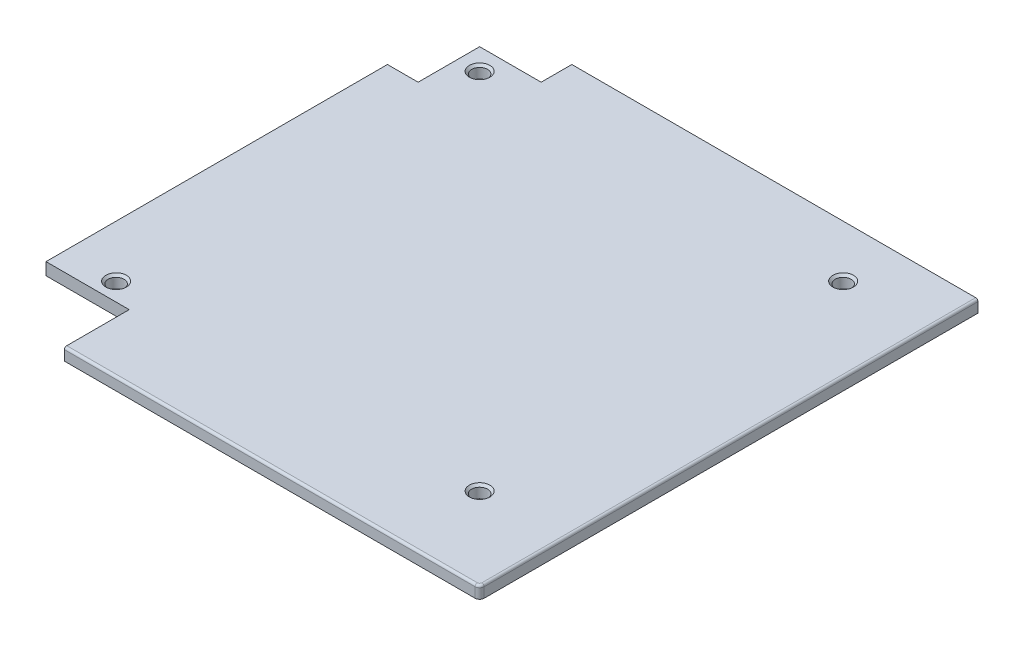
ISO-10303-21;
HEADER;
FILE_DESCRIPTION(('STEP AP214'),'2;1');
FILE_NAME('part.step','',(''),(''),'','','');
FILE_SCHEMA(('AUTOMOTIVE_DESIGN { 1 0 10303 214 1 1 1 1 }'));
ENDSEC;
DATA;
#1=APPLICATION_CONTEXT('core data for automotive mechanical design processes');
#2=APPLICATION_PROTOCOL_DEFINITION('international standard','automotive_design',2000,#1);
#3=PRODUCT_CONTEXT('',#1,'mechanical');
#4=PRODUCT('Part','Part','',(#3));
#5=PRODUCT_RELATED_PRODUCT_CATEGORY('part','',(#4));
#6=PRODUCT_DEFINITION_FORMATION('','',#4);
#7=PRODUCT_DEFINITION_CONTEXT('part definition',#1,'design');
#8=PRODUCT_DEFINITION('design','',#6,#7);
#9=PRODUCT_DEFINITION_SHAPE('','',#8);
#10=(LENGTH_UNIT() NAMED_UNIT(*) SI_UNIT(.MILLI.,.METRE.));
#11=(NAMED_UNIT(*) PLANE_ANGLE_UNIT() SI_UNIT($,.RADIAN.));
#12=(NAMED_UNIT(*) SI_UNIT($,.STERADIAN.) SOLID_ANGLE_UNIT());
#13=UNCERTAINTY_MEASURE_WITH_UNIT(LENGTH_MEASURE(1.E-05),#10,'distance_accuracy_value','');
#14=(GEOMETRIC_REPRESENTATION_CONTEXT(3) GLOBAL_UNCERTAINTY_ASSIGNED_CONTEXT((#13)) GLOBAL_UNIT_ASSIGNED_CONTEXT((#10,
#11,#12)) REPRESENTATION_CONTEXT('',''));
#15=CARTESIAN_POINT('',(0.,0.,0.));
#16=DIRECTION('',(0.,0.,1.));
#17=DIRECTION('',(1.,0.,0.));
#18=AXIS2_PLACEMENT_3D('',#15,#16,#17);
#19=CARTESIAN_POINT('',(0.,-2.,0.));
#20=DIRECTION('',(0.,1.,0.));
#21=DIRECTION('',(0.,0.,1.));
#22=AXIS2_PLACEMENT_3D('',#19,#20,#21);
#23=PLANE('',#22);
#24=CARTESIAN_POINT('',(59.25,-2.,59.25));
#25=DIRECTION('',(0.,1.,0.));
#26=DIRECTION('',(0.,0.,1.));
#27=AXIS2_PLACEMENT_3D('',#24,#25,#26);
#28=CIRCLE('',#27,2.6);
#29=CARTESIAN_POINT('',(59.25,-2.,61.85));
#30=VERTEX_POINT('',#29);
#31=EDGE_CURVE('E301',#30,#30,#28,.T.);
#32=ORIENTED_EDGE('',*,*,#31,.T.);
#33=EDGE_LOOP('',(#32));
#34=FACE_BOUND('',#33,.T.);
#35=CARTESIAN_POINT('',(-59.25,-2.,-59.25));
#36=DIRECTION('',(0.,1.,0.));
#37=DIRECTION('',(0.,0.,1.));
#38=AXIS2_PLACEMENT_3D('',#35,#36,#37);
#39=CIRCLE('',#38,2.6);
#40=CARTESIAN_POINT('',(-59.25,-2.,-56.65));
#41=VERTEX_POINT('',#40);
#42=EDGE_CURVE('E273',#41,#41,#39,.T.);
#43=ORIENTED_EDGE('',*,*,#42,.T.);
#44=EDGE_LOOP('',(#43));
#45=FACE_BOUND('',#44,.T.);
#46=CARTESIAN_POINT('',(84.75,-2.,84.75));
#47=DIRECTION('',(0.,1.,0.));
#48=DIRECTION('',(0.,0.,1.));
#49=AXIS2_PLACEMENT_3D('',#46,#47,#48);
#50=CIRCLE('',#49,1.5);
#51=CARTESIAN_POINT('',(86.25,-2.,84.75));
#52=VERTEX_POINT('',#51);
#53=CARTESIAN_POINT('',(84.75,-2.,86.25));
#54=VERTEX_POINT('',#53);
#55=EDGE_CURVE('E209',#52,#54,#50,.F.);
#56=ORIENTED_EDGE('',*,*,#55,.T.);
#57=DIRECTION('',(-1.,0.,0.));
#58=VECTOR('',#57,1.);
#59=CARTESIAN_POINT('',(0.,-2.,86.25));
#60=LINE('',#59,#58);
#61=CARTESIAN_POINT('',(-49.08,-2.,86.25));
#62=VERTEX_POINT('',#61);
#63=EDGE_CURVE('E187',#54,#62,#60,.T.);
#64=ORIENTED_EDGE('',*,*,#63,.T.);
#65=DIRECTION('',(0.,0.,-1.));
#66=VECTOR('',#65,1.);
#67=CARTESIAN_POINT('',(-49.08,-2.,0.));
#68=LINE('',#67,#66);
#69=CARTESIAN_POINT('',(-49.08,-2.,65.15));
#70=VERTEX_POINT('',#69);
#71=EDGE_CURVE('E234',#62,#70,#68,.T.);
#72=ORIENTED_EDGE('',*,*,#71,.T.);
#73=DIRECTION('',(-1.,0.,0.));
#74=VECTOR('',#73,1.);
#75=CARTESIAN_POINT('',(0.,-2.,65.15));
#76=LINE('',#75,#74);
#77=CARTESIAN_POINT('',(-76.2,-2.,65.15));
#78=VERTEX_POINT('',#77);
#79=EDGE_CURVE('E231',#70,#78,#76,.T.);
#80=ORIENTED_EDGE('',*,*,#79,.T.);
#81=DIRECTION('',(0.,0.,-1.));
#82=VECTOR('',#81,1.);
#83=CARTESIAN_POINT('',(-76.2,-2.,0.));
#84=LINE('',#83,#82);
#85=CARTESIAN_POINT('',(-76.2,-2.,-46.15));
#86=VERTEX_POINT('',#85);
#87=EDGE_CURVE('E228',#78,#86,#84,.T.);
#88=ORIENTED_EDGE('',*,*,#87,.T.);
#89=DIRECTION('',(-1.,0.,0.));
#90=VECTOR('',#89,1.);
#91=CARTESIAN_POINT('',(0.,-2.,-46.15));
#92=LINE('',#91,#90);
#93=CARTESIAN_POINT('',(-66.2,-2.,-46.15));
#94=VERTEX_POINT('',#93);
#95=EDGE_CURVE('E225',#94,#86,#92,.T.);
#96=ORIENTED_EDGE('',*,*,#95,.F.);
#97=DIRECTION('',(0.,0.,-1.));
#98=VECTOR('',#97,1.);
#99=CARTESIAN_POINT('',(-66.2,-2.,0.));
#100=LINE('',#99,#98);
#101=CARTESIAN_POINT('',(-66.2,-2.,-66.2));
#102=VERTEX_POINT('',#101);
#103=EDGE_CURVE('E222',#94,#102,#100,.T.);
#104=ORIENTED_EDGE('',*,*,#103,.T.);
#105=DIRECTION('',(1.,0.,0.));
#106=VECTOR('',#105,1.);
#107=CARTESIAN_POINT('',(0.,-2.,-66.2));
#108=LINE('',#107,#106);
#109=CARTESIAN_POINT('',(-46.15,-2.,-66.2));
#110=VERTEX_POINT('',#109);
#111=EDGE_CURVE('E219',#102,#110,#108,.T.);
#112=ORIENTED_EDGE('',*,*,#111,.T.);
#113=DIRECTION('',(0.,0.,-1.));
#114=VECTOR('',#113,1.);
#115=CARTESIAN_POINT('',(-46.15,-2.,0.));
#116=LINE('',#115,#114);
#117=CARTESIAN_POINT('',(-46.15,-2.,-76.2));
#118=VERTEX_POINT('',#117);
#119=EDGE_CURVE('E217',#110,#118,#116,.T.);
#120=ORIENTED_EDGE('',*,*,#119,.T.);
#121=DIRECTION('',(1.,0.,0.));
#122=VECTOR('',#121,1.);
#123=CARTESIAN_POINT('',(0.,-2.,-76.2));
#124=LINE('',#123,#122);
#125=CARTESIAN_POINT('',(86.25,-2.,-76.2));
#126=VERTEX_POINT('',#125);
#127=EDGE_CURVE('E171',#118,#126,#124,.T.);
#128=ORIENTED_EDGE('',*,*,#127,.T.);
#129=DIRECTION('',(0.,0.,1.));
#130=VECTOR('',#129,1.);
#131=CARTESIAN_POINT('',(86.25,-2.,0.));
#132=LINE('',#131,#130);
#133=EDGE_CURVE('E212',#126,#52,#132,.T.);
#134=ORIENTED_EDGE('',*,*,#133,.T.);
#135=EDGE_LOOP('',(#56,#64,#72,#80,#88,#96,#104,#112,#120,#128,#134));
#136=FACE_BOUND('',#135,.T.);
#137=CARTESIAN_POINT('',(-59.25,-2.,59.25));
#138=DIRECTION('',(0.,1.,0.));
#139=DIRECTION('',(0.,0.,1.));
#140=AXIS2_PLACEMENT_3D('',#137,#138,#139);
#141=CIRCLE('',#140,2.6);
#142=CARTESIAN_POINT('',(-59.25,-2.,61.85));
#143=VERTEX_POINT('',#142);
#144=EDGE_CURVE('E306',#143,#143,#141,.T.);
#145=ORIENTED_EDGE('',*,*,#144,.T.);
#146=EDGE_LOOP('',(#145));
#147=FACE_BOUND('',#146,.T.);
#148=CARTESIAN_POINT('',(59.25,-2.,-59.25));
#149=DIRECTION('',(0.,1.,0.));
#150=DIRECTION('',(0.,0.,1.));
#151=AXIS2_PLACEMENT_3D('',#148,#149,#150);
#152=CIRCLE('',#151,2.6);
#153=CARTESIAN_POINT('',(59.25,-2.,-56.65));
#154=VERTEX_POINT('',#153);
#155=EDGE_CURVE('E296',#154,#154,#152,.T.);
#156=ORIENTED_EDGE('',*,*,#155,.T.);
#157=EDGE_LOOP('',(#156));
#158=FACE_BOUND('',#157,.T.);
#159=ADVANCED_FACE('F69',(#34,#45,#136,#147,#158),#23,.F.);
#160=CARTESIAN_POINT('',(59.25,0.499999999999999,-59.25));
#161=DIRECTION('',(0.,1.,0.));
#162=DIRECTION('',(0.,0.,1.));
#163=AXIS2_PLACEMENT_3D('',#160,#161,#162);
#164=CONICAL_SURFACE('',#163,1.85,0.785398163397446);
#165=CARTESIAN_POINT('',(59.25,2.,-59.25));
#166=DIRECTION('',(0.,1.,0.));
#167=DIRECTION('',(0.,0.,1.));
#168=AXIS2_PLACEMENT_3D('',#165,#166,#167);
#169=CIRCLE('',#168,3.34999999999999);
#170=CARTESIAN_POINT('',(59.25,2.,-55.9));
#171=VERTEX_POINT('',#170);
#172=EDGE_CURVE('E265',#171,#171,#169,.F.);
#173=ORIENTED_EDGE('',*,*,#172,.F.);
#174=EDGE_LOOP('',(#173));
#175=FACE_BOUND('',#174,.T.);
#176=CARTESIAN_POINT('',(59.25,1.25,-59.25));
#177=DIRECTION('',(0.,1.,0.));
#178=DIRECTION('',(0.,0.,1.));
#179=AXIS2_PLACEMENT_3D('',#176,#177,#178);
#180=CIRCLE('',#179,2.6);
#181=CARTESIAN_POINT('',(59.25,1.25,-56.65));
#182=VERTEX_POINT('',#181);
#183=EDGE_CURVE('E213',#182,#182,#180,.F.);
#184=ORIENTED_EDGE('',*,*,#183,.T.);
#185=EDGE_LOOP('',(#184));
#186=FACE_BOUND('',#185,.T.);
#187=ADVANCED_FACE('F333',(#175,#186),#164,.F.);
#188=CARTESIAN_POINT('',(-59.25,0.499999999999999,59.25));
#189=DIRECTION('',(0.,1.,0.));
#190=DIRECTION('',(0.,0.,1.));
#191=AXIS2_PLACEMENT_3D('',#188,#189,#190);
#192=CONICAL_SURFACE('',#191,1.85,0.785398163397446);
#193=CARTESIAN_POINT('',(-59.25,2.,59.25));
#194=DIRECTION('',(0.,1.,0.));
#195=DIRECTION('',(0.,0.,1.));
#196=AXIS2_PLACEMENT_3D('',#193,#194,#195);
#197=CIRCLE('',#196,3.34999999999999);
#198=CARTESIAN_POINT('',(-59.25,2.,62.6));
#199=VERTEX_POINT('',#198);
#200=EDGE_CURVE('E262',#199,#199,#197,.F.);
#201=ORIENTED_EDGE('',*,*,#200,.F.);
#202=EDGE_LOOP('',(#201));
#203=FACE_BOUND('',#202,.T.);
#204=CARTESIAN_POINT('',(-59.25,1.25,59.25));
#205=DIRECTION('',(0.,1.,0.));
#206=DIRECTION('',(0.,0.,1.));
#207=AXIS2_PLACEMENT_3D('',#204,#205,#206);
#208=CIRCLE('',#207,2.6);
#209=CARTESIAN_POINT('',(-59.25,1.25,61.85));
#210=VERTEX_POINT('',#209);
#211=EDGE_CURVE('E276',#210,#210,#208,.F.);
#212=ORIENTED_EDGE('',*,*,#211,.T.);
#213=EDGE_LOOP('',(#212));
#214=FACE_BOUND('',#213,.T.);
#215=ADVANCED_FACE('F340',(#203,#214),#192,.F.);
#216=CARTESIAN_POINT('',(59.25,0.499999999999999,59.25));
#217=DIRECTION('',(0.,1.,0.));
#218=DIRECTION('',(0.,0.,1.));
#219=AXIS2_PLACEMENT_3D('',#216,#217,#218);
#220=CONICAL_SURFACE('',#219,1.85,0.785398163397446);
#221=CARTESIAN_POINT('',(59.25,2.,59.25));
#222=DIRECTION('',(0.,1.,0.));
#223=DIRECTION('',(0.,0.,1.));
#224=AXIS2_PLACEMENT_3D('',#221,#222,#223);
#225=CIRCLE('',#224,3.34999999999999);
#226=CARTESIAN_POINT('',(59.25,2.,62.6));
#227=VERTEX_POINT('',#226);
#228=EDGE_CURVE('E259',#227,#227,#225,.F.);
#229=ORIENTED_EDGE('',*,*,#228,.F.);
#230=EDGE_LOOP('',(#229));
#231=FACE_BOUND('',#230,.T.);
#232=CARTESIAN_POINT('',(59.25,1.25,59.25));
#233=DIRECTION('',(0.,1.,0.));
#234=DIRECTION('',(0.,0.,1.));
#235=AXIS2_PLACEMENT_3D('',#232,#233,#234);
#236=CIRCLE('',#235,2.6);
#237=CARTESIAN_POINT('',(59.25,1.25,61.85));
#238=VERTEX_POINT('',#237);
#239=EDGE_CURVE('E272',#238,#238,#236,.F.);
#240=ORIENTED_EDGE('',*,*,#239,.T.);
#241=EDGE_LOOP('',(#240));
#242=FACE_BOUND('',#241,.T.);
#243=ADVANCED_FACE('F393',(#231,#242),#220,.F.);
#244=CARTESIAN_POINT('',(-59.25,0.499999999999999,-59.25));
#245=DIRECTION('',(0.,1.,0.));
#246=DIRECTION('',(0.,0.,1.));
#247=AXIS2_PLACEMENT_3D('',#244,#245,#246);
#248=CONICAL_SURFACE('',#247,1.85,0.785398163397446);
#249=CARTESIAN_POINT('',(-59.25,2.,-59.25));
#250=DIRECTION('',(0.,1.,0.));
#251=DIRECTION('',(0.,0.,1.));
#252=AXIS2_PLACEMENT_3D('',#249,#250,#251);
#253=CIRCLE('',#252,3.34999999999999);
#254=CARTESIAN_POINT('',(-59.25,2.,-55.9));
#255=VERTEX_POINT('',#254);
#256=EDGE_CURVE('E256',#255,#255,#253,.F.);
#257=ORIENTED_EDGE('',*,*,#256,.F.);
#258=EDGE_LOOP('',(#257));
#259=FACE_BOUND('',#258,.T.);
#260=CARTESIAN_POINT('',(-59.25,1.25,-59.25));
#261=DIRECTION('',(0.,1.,0.));
#262=DIRECTION('',(0.,0.,1.));
#263=AXIS2_PLACEMENT_3D('',#260,#261,#262);
#264=CIRCLE('',#263,2.6);
#265=CARTESIAN_POINT('',(-59.25,1.25,-56.65));
#266=VERTEX_POINT('',#265);
#267=EDGE_CURVE('E269',#266,#266,#264,.F.);
#268=ORIENTED_EDGE('',*,*,#267,.T.);
#269=EDGE_LOOP('',(#268));
#270=FACE_BOUND('',#269,.T.);
#271=ADVANCED_FACE('F382',(#259,#270),#248,.F.);
#272=CARTESIAN_POINT('',(84.75,2.,84.75));
#273=DIRECTION('',(0.,-1.,0.));
#274=DIRECTION('',(0.,0.,-1.));
#275=AXIS2_PLACEMENT_3D('',#272,#273,#274);
#276=CYLINDRICAL_SURFACE('',#275,1.5);
#277=DIRECTION('',(0.,-1.,0.));
#278=VECTOR('',#277,1.);
#279=CARTESIAN_POINT('',(86.25,2.,84.75));
#280=LINE('',#279,#278);
#281=CARTESIAN_POINT('',(86.25,1.25,84.75));
#282=VERTEX_POINT('',#281);
#283=EDGE_CURVE('E254',#282,#52,#280,.T.);
#284=ORIENTED_EDGE('',*,*,#283,.F.);
#285=CARTESIAN_POINT('',(84.75,1.25,84.75));
#286=DIRECTION('',(0.,1.,0.));
#287=DIRECTION('',(0.,0.,1.));
#288=AXIS2_PLACEMENT_3D('',#285,#286,#287);
#289=CIRCLE('',#288,1.5);
#290=CARTESIAN_POINT('',(84.75,1.25,86.25));
#291=VERTEX_POINT('',#290);
#292=EDGE_CURVE('E93',#282,#291,#289,.F.);
#293=ORIENTED_EDGE('',*,*,#292,.T.);
#294=DIRECTION('',(0.,-1.,0.));
#295=VECTOR('',#294,1.);
#296=CARTESIAN_POINT('',(84.75,2.,86.25));
#297=LINE('',#296,#295);
#298=EDGE_CURVE('E208',#291,#54,#297,.T.);
#299=ORIENTED_EDGE('',*,*,#298,.T.);
#300=ORIENTED_EDGE('',*,*,#55,.F.);
#301=EDGE_LOOP('',(#284,#293,#299,#300));
#302=FACE_BOUND('',#301,.T.);
#303=ADVANCED_FACE('F379',(#302),#276,.T.);
#304=CARTESIAN_POINT('',(86.25,2.,0.));
#305=DIRECTION('',(1.,0.,0.));
#306=DIRECTION('',(0.,0.,-1.));
#307=AXIS2_PLACEMENT_3D('',#304,#305,#306);
#308=PLANE('',#307);
#309=DIRECTION('',(0.,-1.,0.));
#310=VECTOR('',#309,1.);
#311=CARTESIAN_POINT('',(86.25,2.,-76.2));
#312=LINE('',#311,#310);
#313=CARTESIAN_POINT('',(86.25,1.25,-76.2));
#314=VERTEX_POINT('',#313);
#315=EDGE_CURVE('E176',#314,#126,#312,.T.);
#316=ORIENTED_EDGE('',*,*,#315,.F.);
#317=DIRECTION('',(0.,0.,1.));
#318=VECTOR('',#317,1.);
#319=CARTESIAN_POINT('',(86.25,1.25,0.));
#320=LINE('',#319,#318);
#321=EDGE_CURVE('E268',#314,#282,#320,.T.);
#322=ORIENTED_EDGE('',*,*,#321,.T.);
#323=ORIENTED_EDGE('',*,*,#283,.T.);
#324=ORIENTED_EDGE('',*,*,#133,.F.);
#325=EDGE_LOOP('',(#316,#322,#323,#324));
#326=FACE_BOUND('',#325,.T.);
#327=ADVANCED_FACE('F376',(#326),#308,.T.);
#328=CARTESIAN_POINT('',(0.,2.,-76.2));
#329=DIRECTION('',(0.,0.,-1.));
#330=DIRECTION('',(-1.,0.,0.));
#331=AXIS2_PLACEMENT_3D('',#328,#329,#330);
#332=PLANE('',#331);
#333=DIRECTION('',(1.,0.,0.));
#334=VECTOR('',#333,1.);
#335=CARTESIAN_POINT('',(0.,2.,-76.2));
#336=LINE('',#335,#334);
#337=CARTESIAN_POINT('',(-46.15,2.,-76.2));
#338=VERTEX_POINT('',#337);
#339=CARTESIAN_POINT('',(85.5,2.,-76.2));
#340=VERTEX_POINT('',#339);
#341=EDGE_CURVE('E168',#338,#340,#336,.T.);
#342=ORIENTED_EDGE('',*,*,#341,.T.);
#343=CARTESIAN_POINT('',(85.5,1.25,-76.2));
#344=DIRECTION('',(0.,0.,-1.));
#345=DIRECTION('',(-1.,0.,0.));
#346=AXIS2_PLACEMENT_3D('',#343,#344,#345);
#347=CIRCLE('',#346,0.75);
#348=EDGE_CURVE('E288',#340,#314,#347,.T.);
#349=ORIENTED_EDGE('',*,*,#348,.T.);
#350=ORIENTED_EDGE('',*,*,#315,.T.);
#351=ORIENTED_EDGE('',*,*,#127,.F.);
#352=DIRECTION('',(0.,-1.,0.));
#353=VECTOR('',#352,1.);
#354=CARTESIAN_POINT('',(-46.15,2.,-76.2));
#355=LINE('',#354,#353);
#356=EDGE_CURVE('E165',#338,#118,#355,.T.);
#357=ORIENTED_EDGE('',*,*,#356,.F.);
#358=EDGE_LOOP('',(#342,#349,#350,#351,#357));
#359=FACE_BOUND('',#358,.T.);
#360=ADVANCED_FACE('F167',(#359),#332,.T.);
#361=CARTESIAN_POINT('',(-46.15,2.,0.));
#362=DIRECTION('',(-1.,0.,0.));
#363=DIRECTION('',(0.,0.,1.));
#364=AXIS2_PLACEMENT_3D('',#361,#362,#363);
#365=PLANE('',#364);
#366=ORIENTED_EDGE('',*,*,#119,.F.);
#367=DIRECTION('',(0.,-1.,0.));
#368=VECTOR('',#367,1.);
#369=CARTESIAN_POINT('',(-46.15,2.,-66.2));
#370=LINE('',#369,#368);
#371=CARTESIAN_POINT('',(-46.15,2.,-66.2));
#372=VERTEX_POINT('',#371);
#373=EDGE_CURVE('E177',#372,#110,#370,.T.);
#374=ORIENTED_EDGE('',*,*,#373,.F.);
#375=DIRECTION('',(0.,0.,-1.));
#376=VECTOR('',#375,1.);
#377=CARTESIAN_POINT('',(-46.15,2.,0.));
#378=LINE('',#377,#376);
#379=EDGE_CURVE('E183',#372,#338,#378,.T.);
#380=ORIENTED_EDGE('',*,*,#379,.T.);
#381=ORIENTED_EDGE('',*,*,#356,.T.);
#382=EDGE_LOOP('',(#366,#374,#380,#381));
#383=FACE_BOUND('',#382,.T.);
#384=ADVANCED_FACE('F189',(#383),#365,.T.);
#385=CARTESIAN_POINT('',(0.,2.,-66.2));
#386=DIRECTION('',(0.,0.,-1.));
#387=DIRECTION('',(-1.,0.,0.));
#388=AXIS2_PLACEMENT_3D('',#385,#386,#387);
#389=PLANE('',#388);
#390=ORIENTED_EDGE('',*,*,#111,.F.);
#391=DIRECTION('',(0.,-1.,0.));
#392=VECTOR('',#391,1.);
#393=CARTESIAN_POINT('',(-66.2,2.,-66.2));
#394=LINE('',#393,#392);
#395=CARTESIAN_POINT('',(-66.2,2.,-66.2));
#396=VERTEX_POINT('',#395);
#397=EDGE_CURVE('E250',#396,#102,#394,.T.);
#398=ORIENTED_EDGE('',*,*,#397,.F.);
#399=DIRECTION('',(1.,0.,0.));
#400=VECTOR('',#399,1.);
#401=CARTESIAN_POINT('',(0.,2.,-66.2));
#402=LINE('',#401,#400);
#403=EDGE_CURVE('E190',#396,#372,#402,.T.);
#404=ORIENTED_EDGE('',*,*,#403,.T.);
#405=ORIENTED_EDGE('',*,*,#373,.T.);
#406=EDGE_LOOP('',(#390,#398,#404,#405));
#407=FACE_BOUND('',#406,.T.);
#408=ADVANCED_FACE('F367',(#407),#389,.T.);
#409=CARTESIAN_POINT('',(-66.2,2.,0.));
#410=DIRECTION('',(-1.,0.,0.));
#411=DIRECTION('',(0.,0.,1.));
#412=AXIS2_PLACEMENT_3D('',#409,#410,#411);
#413=PLANE('',#412);
#414=ORIENTED_EDGE('',*,*,#103,.F.);
#415=DIRECTION('',(0.,-1.,0.));
#416=VECTOR('',#415,1.);
#417=CARTESIAN_POINT('',(-66.2,2.,-46.15));
#418=LINE('',#417,#416);
#419=CARTESIAN_POINT('',(-66.2,2.,-46.15));
#420=VERTEX_POINT('',#419);
#421=EDGE_CURVE('E248',#420,#94,#418,.T.);
#422=ORIENTED_EDGE('',*,*,#421,.F.);
#423=DIRECTION('',(0.,0.,-1.));
#424=VECTOR('',#423,1.);
#425=CARTESIAN_POINT('',(-66.2,2.,0.));
#426=LINE('',#425,#424);
#427=EDGE_CURVE('E192',#420,#396,#426,.T.);
#428=ORIENTED_EDGE('',*,*,#427,.T.);
#429=ORIENTED_EDGE('',*,*,#397,.T.);
#430=EDGE_LOOP('',(#414,#422,#428,#429));
#431=FACE_BOUND('',#430,.T.);
#432=ADVANCED_FACE('F363',(#431),#413,.T.);
#433=CARTESIAN_POINT('',(0.,2.,-46.15));
#434=DIRECTION('',(0.,0.,1.));
#435=DIRECTION('',(1.,0.,0.));
#436=AXIS2_PLACEMENT_3D('',#433,#434,#435);
#437=PLANE('',#436);
#438=ORIENTED_EDGE('',*,*,#95,.T.);
#439=DIRECTION('',(0.,-1.,0.));
#440=VECTOR('',#439,1.);
#441=CARTESIAN_POINT('',(-76.2,2.,-46.15));
#442=LINE('',#441,#440);
#443=CARTESIAN_POINT('',(-76.2,2.,-46.15));
#444=VERTEX_POINT('',#443);
#445=EDGE_CURVE('E246',#444,#86,#442,.T.);
#446=ORIENTED_EDGE('',*,*,#445,.F.);
#447=DIRECTION('',(-1.,0.,0.));
#448=VECTOR('',#447,1.);
#449=CARTESIAN_POINT('',(0.,2.,-46.15));
#450=LINE('',#449,#448);
#451=EDGE_CURVE('E198',#420,#444,#450,.T.);
#452=ORIENTED_EDGE('',*,*,#451,.F.);
#453=ORIENTED_EDGE('',*,*,#421,.T.);
#454=EDGE_LOOP('',(#438,#446,#452,#453));
#455=FACE_BOUND('',#454,.T.);
#456=ADVANCED_FACE('F359',(#455),#437,.F.);
#457=CARTESIAN_POINT('',(-76.2,2.,0.));
#458=DIRECTION('',(-1.,0.,0.));
#459=DIRECTION('',(0.,0.,1.));
#460=AXIS2_PLACEMENT_3D('',#457,#458,#459);
#461=PLANE('',#460);
#462=ORIENTED_EDGE('',*,*,#87,.F.);
#463=DIRECTION('',(0.,-1.,0.));
#464=VECTOR('',#463,1.);
#465=CARTESIAN_POINT('',(-76.2,2.,65.15));
#466=LINE('',#465,#464);
#467=CARTESIAN_POINT('',(-76.2,2.,65.15));
#468=VERTEX_POINT('',#467);
#469=EDGE_CURVE('E244',#468,#78,#466,.T.);
#470=ORIENTED_EDGE('',*,*,#469,.F.);
#471=DIRECTION('',(0.,0.,-1.));
#472=VECTOR('',#471,1.);
#473=CARTESIAN_POINT('',(-76.2,2.,0.));
#474=LINE('',#473,#472);
#475=EDGE_CURVE('E200',#468,#444,#474,.T.);
#476=ORIENTED_EDGE('',*,*,#475,.T.);
#477=ORIENTED_EDGE('',*,*,#445,.T.);
#478=EDGE_LOOP('',(#462,#470,#476,#477));
#479=FACE_BOUND('',#478,.T.);
#480=ADVANCED_FACE('F355',(#479),#461,.T.);
#481=CARTESIAN_POINT('',(0.,2.,65.15));
#482=DIRECTION('',(0.,0.,1.));
#483=DIRECTION('',(1.,0.,0.));
#484=AXIS2_PLACEMENT_3D('',#481,#482,#483);
#485=PLANE('',#484);
#486=ORIENTED_EDGE('',*,*,#79,.F.);
#487=DIRECTION('',(0.,-1.,0.));
#488=VECTOR('',#487,1.);
#489=CARTESIAN_POINT('',(-49.08,2.,65.15));
#490=LINE('',#489,#488);
#491=CARTESIAN_POINT('',(-49.08,2.,65.15));
#492=VERTEX_POINT('',#491);
#493=EDGE_CURVE('E242',#492,#70,#490,.T.);
#494=ORIENTED_EDGE('',*,*,#493,.F.);
#495=DIRECTION('',(-1.,0.,0.));
#496=VECTOR('',#495,1.);
#497=CARTESIAN_POINT('',(0.,2.,65.15));
#498=LINE('',#497,#496);
#499=EDGE_CURVE('E203',#492,#468,#498,.T.);
#500=ORIENTED_EDGE('',*,*,#499,.T.);
#501=ORIENTED_EDGE('',*,*,#469,.T.);
#502=EDGE_LOOP('',(#486,#494,#500,#501));
#503=FACE_BOUND('',#502,.T.);
#504=ADVANCED_FACE('F352',(#503),#485,.T.);
#505=CARTESIAN_POINT('',(-49.08,2.,0.));
#506=DIRECTION('',(-1.,0.,0.));
#507=DIRECTION('',(0.,0.,1.));
#508=AXIS2_PLACEMENT_3D('',#505,#506,#507);
#509=PLANE('',#508);
#510=DIRECTION('',(0.,-1.,0.));
#511=VECTOR('',#510,1.);
#512=CARTESIAN_POINT('',(-49.08,2.,86.25));
#513=LINE('',#512,#511);
#514=CARTESIAN_POINT('',(-49.08,1.25,86.25));
#515=VERTEX_POINT('',#514);
#516=EDGE_CURVE('E240',#515,#62,#513,.T.);
#517=ORIENTED_EDGE('',*,*,#516,.F.);
#518=CARTESIAN_POINT('',(-49.08,1.25,85.5));
#519=DIRECTION('',(-1.,0.,0.));
#520=DIRECTION('',(0.,0.,1.));
#521=AXIS2_PLACEMENT_3D('',#518,#519,#520);
#522=CIRCLE('',#521,0.75);
#523=CARTESIAN_POINT('',(-49.08,2.,85.5));
#524=VERTEX_POINT('',#523);
#525=EDGE_CURVE('E12',#515,#524,#522,.T.);
#526=ORIENTED_EDGE('',*,*,#525,.T.);
#527=DIRECTION('',(0.,0.,-1.));
#528=VECTOR('',#527,1.);
#529=CARTESIAN_POINT('',(-49.08,2.,0.));
#530=LINE('',#529,#528);
#531=EDGE_CURVE('E206',#524,#492,#530,.T.);
#532=ORIENTED_EDGE('',*,*,#531,.T.);
#533=ORIENTED_EDGE('',*,*,#493,.T.);
#534=ORIENTED_EDGE('',*,*,#71,.F.);
#535=EDGE_LOOP('',(#517,#526,#532,#533,#534));
#536=FACE_BOUND('',#535,.T.);
#537=ADVANCED_FACE('F349',(#536),#509,.T.);
#538=CARTESIAN_POINT('',(0.,2.,86.25));
#539=DIRECTION('',(0.,0.,1.));
#540=DIRECTION('',(1.,0.,0.));
#541=AXIS2_PLACEMENT_3D('',#538,#539,#540);
#542=PLANE('',#541);
#543=ORIENTED_EDGE('',*,*,#298,.F.);
#544=DIRECTION('',(-1.,0.,0.));
#545=VECTOR('',#544,1.);
#546=CARTESIAN_POINT('',(0.,1.25,86.25));
#547=LINE('',#546,#545);
#548=EDGE_CURVE('E78',#291,#515,#547,.T.);
#549=ORIENTED_EDGE('',*,*,#548,.T.);
#550=ORIENTED_EDGE('',*,*,#516,.T.);
#551=ORIENTED_EDGE('',*,*,#63,.F.);
#552=EDGE_LOOP('',(#543,#549,#550,#551));
#553=FACE_BOUND('',#552,.T.);
#554=ADVANCED_FACE('F346',(#553),#542,.T.);
#555=CARTESIAN_POINT('',(0.,2.,0.));
#556=DIRECTION('',(0.,1.,0.));
#557=DIRECTION('',(0.,0.,1.));
#558=AXIS2_PLACEMENT_3D('',#555,#556,#557);
#559=PLANE('',#558);
#560=ORIENTED_EDGE('',*,*,#172,.T.);
#561=EDGE_LOOP('',(#560));
#562=FACE_BOUND('',#561,.T.);
#563=ORIENTED_EDGE('',*,*,#200,.T.);
#564=EDGE_LOOP('',(#563));
#565=FACE_BOUND('',#564,.T.);
#566=ORIENTED_EDGE('',*,*,#228,.T.);
#567=EDGE_LOOP('',(#566));
#568=FACE_BOUND('',#567,.T.);
#569=ORIENTED_EDGE('',*,*,#256,.T.);
#570=EDGE_LOOP('',(#569));
#571=FACE_BOUND('',#570,.T.);
#572=CARTESIAN_POINT('',(84.75,2.,84.75));
#573=DIRECTION('',(0.,1.,0.));
#574=DIRECTION('',(0.,0.,1.));
#575=AXIS2_PLACEMENT_3D('',#572,#573,#574);
#576=CIRCLE('',#575,0.750000000000001);
#577=CARTESIAN_POINT('',(84.75,2.,85.5));
#578=VERTEX_POINT('',#577);
#579=CARTESIAN_POINT('',(85.5,2.,84.75));
#580=VERTEX_POINT('',#579);
#581=EDGE_CURVE('E285',#578,#580,#576,.T.);
#582=ORIENTED_EDGE('',*,*,#581,.T.);
#583=DIRECTION('',(0.,0.,1.));
#584=VECTOR('',#583,1.);
#585=CARTESIAN_POINT('',(85.5,2.,0.));
#586=LINE('',#585,#584);
#587=EDGE_CURVE('E186',#580,#340,#586,.F.);
#588=ORIENTED_EDGE('',*,*,#587,.T.);
#589=ORIENTED_EDGE('',*,*,#341,.F.);
#590=ORIENTED_EDGE('',*,*,#379,.F.);
#591=ORIENTED_EDGE('',*,*,#403,.F.);
#592=ORIENTED_EDGE('',*,*,#427,.F.);
#593=ORIENTED_EDGE('',*,*,#451,.T.);
#594=ORIENTED_EDGE('',*,*,#475,.F.);
#595=ORIENTED_EDGE('',*,*,#499,.F.);
#596=ORIENTED_EDGE('',*,*,#531,.F.);
#597=DIRECTION('',(-1.,0.,0.));
#598=VECTOR('',#597,1.);
#599=CARTESIAN_POINT('',(0.,2.,85.5));
#600=LINE('',#599,#598);
#601=EDGE_CURVE('E283',#524,#578,#600,.F.);
#602=ORIENTED_EDGE('',*,*,#601,.T.);
#603=EDGE_LOOP('',(#582,#588,#589,#590,#591,#592,#593,#594,#595,#596,#602));
#604=FACE_BOUND('',#603,.T.);
#605=ADVANCED_FACE('F181',(#562,#565,#568,#571,#604),#559,.T.);
#606=CARTESIAN_POINT('',(-59.25,9.35391052434009,-59.25));
#607=DIRECTION('',(0.,-1.,0.));
#608=DIRECTION('',(0.,0.,-1.));
#609=AXIS2_PLACEMENT_3D('',#606,#607,#608);
#610=CYLINDRICAL_SURFACE('',#609,2.6);
#611=ORIENTED_EDGE('',*,*,#267,.F.);
#612=EDGE_LOOP('',(#611));
#613=FACE_BOUND('',#612,.T.);
#614=ORIENTED_EDGE('',*,*,#42,.F.);
#615=EDGE_LOOP('',(#614));
#616=FACE_BOUND('',#615,.T.);
#617=ADVANCED_FACE('F328',(#613,#616),#610,.F.);
#618=CARTESIAN_POINT('',(59.25,9.35391052434009,59.25));
#619=DIRECTION('',(0.,-1.,0.));
#620=DIRECTION('',(0.,0.,-1.));
#621=AXIS2_PLACEMENT_3D('',#618,#619,#620);
#622=CYLINDRICAL_SURFACE('',#621,2.6);
#623=ORIENTED_EDGE('',*,*,#239,.F.);
#624=EDGE_LOOP('',(#623));
#625=FACE_BOUND('',#624,.T.);
#626=ORIENTED_EDGE('',*,*,#31,.F.);
#627=EDGE_LOOP('',(#626));
#628=FACE_BOUND('',#627,.T.);
#629=ADVANCED_FACE('F319',(#625,#628),#622,.F.);
#630=CARTESIAN_POINT('',(-59.25,9.35391052434009,59.25));
#631=DIRECTION('',(0.,-1.,0.));
#632=DIRECTION('',(0.,0.,-1.));
#633=AXIS2_PLACEMENT_3D('',#630,#631,#632);
#634=CYLINDRICAL_SURFACE('',#633,2.6);
#635=ORIENTED_EDGE('',*,*,#211,.F.);
#636=EDGE_LOOP('',(#635));
#637=FACE_BOUND('',#636,.T.);
#638=ORIENTED_EDGE('',*,*,#144,.F.);
#639=EDGE_LOOP('',(#638));
#640=FACE_BOUND('',#639,.T.);
#641=ADVANCED_FACE('F316',(#637,#640),#634,.F.);
#642=CARTESIAN_POINT('',(59.25,9.35391052434009,-59.25));
#643=DIRECTION('',(0.,-1.,0.));
#644=DIRECTION('',(0.,0.,-1.));
#645=AXIS2_PLACEMENT_3D('',#642,#643,#644);
#646=CYLINDRICAL_SURFACE('',#645,2.6);
#647=ORIENTED_EDGE('',*,*,#183,.F.);
#648=EDGE_LOOP('',(#647));
#649=FACE_BOUND('',#648,.T.);
#650=ORIENTED_EDGE('',*,*,#155,.F.);
#651=EDGE_LOOP('',(#650));
#652=FACE_BOUND('',#651,.T.);
#653=ADVANCED_FACE('F318',(#649,#652),#646,.F.);
#654=CARTESIAN_POINT('',(0.,1.25,85.5));
#655=DIRECTION('',(-1.,0.,0.));
#656=DIRECTION('',(0.,0.,1.));
#657=AXIS2_PLACEMENT_3D('',#654,#655,#656);
#658=CYLINDRICAL_SURFACE('',#657,0.75);
#659=ORIENTED_EDGE('',*,*,#525,.F.);
#660=ORIENTED_EDGE('',*,*,#548,.F.);
#661=CARTESIAN_POINT('',(84.75,1.25,85.5));
#662=DIRECTION('',(1.,0.,0.));
#663=DIRECTION('',(0.,0.,-1.));
#664=AXIS2_PLACEMENT_3D('',#661,#662,#663);
#665=CIRCLE('',#664,0.75);
#666=EDGE_CURVE('E73',#578,#291,#665,.T.);
#667=ORIENTED_EDGE('',*,*,#666,.F.);
#668=ORIENTED_EDGE('',*,*,#601,.F.);
#669=EDGE_LOOP('',(#659,#660,#667,#668));
#670=FACE_BOUND('',#669,.T.);
#671=ADVANCED_FACE('F71',(#670),#658,.T.);
#672=CARTESIAN_POINT('',(84.75,1.25,84.75));
#673=DIRECTION('',(0.,1.,0.));
#674=DIRECTION('',(0.,0.,1.));
#675=AXIS2_PLACEMENT_3D('',#672,#673,#674);
#676=TOROIDAL_SURFACE('',#675,0.750000000000001,0.75);
#677=ORIENTED_EDGE('',*,*,#666,.T.);
#678=ORIENTED_EDGE('',*,*,#292,.F.);
#679=CARTESIAN_POINT('',(85.5,1.25,84.75));
#680=DIRECTION('',(0.,0.,-1.));
#681=DIRECTION('',(-1.,0.,0.));
#682=AXIS2_PLACEMENT_3D('',#679,#680,#681);
#683=CIRCLE('',#682,0.75);
#684=EDGE_CURVE('E291',#580,#282,#683,.T.);
#685=ORIENTED_EDGE('',*,*,#684,.F.);
#686=ORIENTED_EDGE('',*,*,#581,.F.);
#687=EDGE_LOOP('',(#677,#678,#685,#686));
#688=FACE_BOUND('',#687,.T.);
#689=ADVANCED_FACE('F408',(#688),#676,.T.);
#690=CARTESIAN_POINT('',(85.5,1.25,0.));
#691=DIRECTION('',(0.,0.,1.));
#692=DIRECTION('',(1.,0.,0.));
#693=AXIS2_PLACEMENT_3D('',#690,#691,#692);
#694=CYLINDRICAL_SURFACE('',#693,0.75);
#695=ORIENTED_EDGE('',*,*,#348,.F.);
#696=ORIENTED_EDGE('',*,*,#587,.F.);
#697=ORIENTED_EDGE('',*,*,#684,.T.);
#698=ORIENTED_EDGE('',*,*,#321,.F.);
#699=EDGE_LOOP('',(#695,#696,#697,#698));
#700=FACE_BOUND('',#699,.T.);
#701=ADVANCED_FACE('F406',(#700),#694,.T.);
#702=CLOSED_SHELL('',(#159,#187,#215,#243,#271,#303,#327,#360,#384,#408,#432,#456,#480,#504,
#537,#554,#605,#617,#629,#641,#653,#671,#689,#701));
#703=MANIFOLD_SOLID_BREP('B2',#702);
#704=ADVANCED_BREP_SHAPE_REPRESENTATION('',(#18,#703),#14);
#705=SHAPE_DEFINITION_REPRESENTATION(#9,#704);
ENDSEC;
END-ISO-10303-21;
